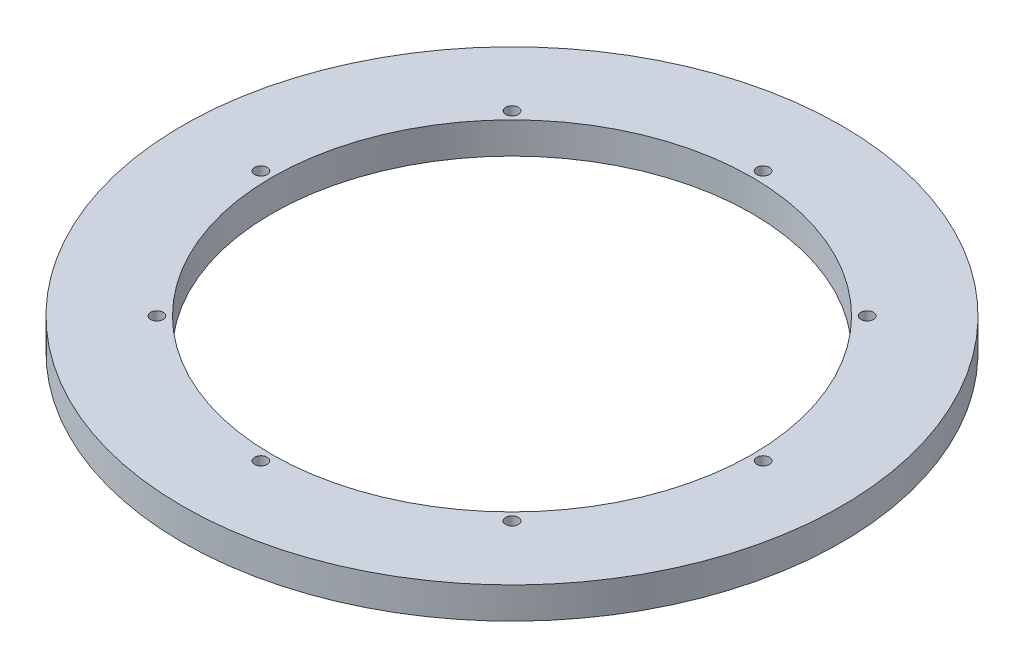
ISO-10303-21;
HEADER;
FILE_DESCRIPTION(('STEP AP214'),'2;1');
FILE_NAME('part.step','',(''),(''),'','','');
FILE_SCHEMA(('AUTOMOTIVE_DESIGN { 1 0 10303 214 1 1 1 1 }'));
ENDSEC;
DATA;
#1=APPLICATION_CONTEXT('core data for automotive mechanical design processes');
#2=APPLICATION_PROTOCOL_DEFINITION('international standard','automotive_design',2000,#1);
#3=PRODUCT_CONTEXT('',#1,'mechanical');
#4=PRODUCT('Part','Part','',(#3));
#5=PRODUCT_RELATED_PRODUCT_CATEGORY('part','',(#4));
#6=PRODUCT_DEFINITION_FORMATION('','',#4);
#7=PRODUCT_DEFINITION_CONTEXT('part definition',#1,'design');
#8=PRODUCT_DEFINITION('design','',#6,#7);
#9=PRODUCT_DEFINITION_SHAPE('','',#8);
#10=(LENGTH_UNIT() NAMED_UNIT(*) SI_UNIT(.MILLI.,.METRE.));
#11=(NAMED_UNIT(*) PLANE_ANGLE_UNIT() SI_UNIT($,.RADIAN.));
#12=(NAMED_UNIT(*) SI_UNIT($,.STERADIAN.) SOLID_ANGLE_UNIT());
#13=UNCERTAINTY_MEASURE_WITH_UNIT(LENGTH_MEASURE(1.E-05),#10,'distance_accuracy_value','');
#14=(GEOMETRIC_REPRESENTATION_CONTEXT(3) GLOBAL_UNCERTAINTY_ASSIGNED_CONTEXT((#13)) GLOBAL_UNIT_ASSIGNED_CONTEXT((#10,
#11,#12)) REPRESENTATION_CONTEXT('',''));
#15=CARTESIAN_POINT('',(0.,0.,0.));
#16=DIRECTION('',(0.,0.,1.));
#17=DIRECTION('',(1.,0.,0.));
#18=AXIS2_PLACEMENT_3D('',#15,#16,#17);
#19=CARTESIAN_POINT('',(0.,-3585.42194874803,-1.2298890050276E-11));
#20=DIRECTION('',(0.,-1.,0.));
#21=DIRECTION('',(0.,0.,-1.));
#22=AXIS2_PLACEMENT_3D('',#19,#20,#21);
#23=CYLINDRICAL_SURFACE('',#22,229.5);
#24=CARTESIAN_POINT('',(0.,15.000000000001,0.));
#25=DIRECTION('',(0.,-1.,0.));
#26=DIRECTION('',(0.,0.,-1.));
#27=AXIS2_PLACEMENT_3D('',#24,#25,#26);
#28=CIRCLE('',#27,229.5);
#29=CARTESIAN_POINT('',(0.,15.0000000000018,-229.5));
#30=VERTEX_POINT('',#29);
#31=EDGE_CURVE('E10',#30,#30,#28,.T.);
#32=ORIENTED_EDGE('',*,*,#31,.F.);
#33=EDGE_LOOP('',(#32));
#34=FACE_BOUND('',#33,.T.);
#35=CARTESIAN_POINT('',(0.,-14.9999999999992,0.));
#36=DIRECTION('',(0.,-1.,0.));
#37=DIRECTION('',(0.,0.,-1.));
#38=AXIS2_PLACEMENT_3D('',#35,#36,#37);
#39=CIRCLE('',#38,229.5);
#40=CARTESIAN_POINT('',(0.,-14.9999999999984,-229.500000000001));
#41=VERTEX_POINT('',#40);
#42=EDGE_CURVE('E54',#41,#41,#39,.T.);
#43=ORIENTED_EDGE('',*,*,#42,.T.);
#44=EDGE_LOOP('',(#43));
#45=FACE_BOUND('',#44,.T.);
#46=ADVANCED_FACE('F37',(#34,#45),#23,.F.);
#47=CARTESIAN_POINT('',(0.,14.9999999999999,315.));
#48=DIRECTION('',(0.,-1.,0.));
#49=DIRECTION('',(0.,0.,-1.));
#50=AXIS2_PLACEMENT_3D('',#47,#48,#49);
#51=PLANE('',#50);
#52=CARTESIAN_POINT('',(0.,15.0000000000018,-240.));
#53=DIRECTION('',(0.,1.,0.));
#54=DIRECTION('',(0.,0.,1.));
#55=AXIS2_PLACEMENT_3D('',#52,#53,#54);
#56=CIRCLE('',#55,6.);
#57=CARTESIAN_POINT('',(0.,15.0000000000018,-234.));
#58=VERTEX_POINT('',#57);
#59=EDGE_CURVE('E117',#58,#58,#56,.T.);
#60=ORIENTED_EDGE('',*,*,#59,.F.);
#61=EDGE_LOOP('',(#60));
#62=FACE_BOUND('',#61,.T.);
#63=CARTESIAN_POINT('',(169.705627484772,15.0000000000015,-169.705627484771));
#64=DIRECTION('',(0.,1.,0.));
#65=DIRECTION('',(0.,0.,1.));
#66=AXIS2_PLACEMENT_3D('',#63,#64,#65);
#67=CIRCLE('',#66,5.99999999999998);
#68=CARTESIAN_POINT('',(169.705627484772,15.0000000000015,-163.705627484771));
#69=VERTEX_POINT('',#68);
#70=EDGE_CURVE('E109',#69,#69,#67,.T.);
#71=ORIENTED_EDGE('',*,*,#70,.F.);
#72=EDGE_LOOP('',(#71));
#73=FACE_BOUND('',#72,.T.);
#74=CARTESIAN_POINT('',(240.,15.000000000001,8.89409256305642E-13));
#75=DIRECTION('',(0.,1.,0.));
#76=DIRECTION('',(0.,0.,1.));
#77=AXIS2_PLACEMENT_3D('',#74,#75,#76);
#78=CIRCLE('',#77,6.);
#79=CARTESIAN_POINT('',(240.,15.0000000000009,6.00000000000089));
#80=VERTEX_POINT('',#79);
#81=EDGE_CURVE('E101',#80,#80,#78,.T.);
#82=ORIENTED_EDGE('',*,*,#81,.F.);
#83=EDGE_LOOP('',(#82));
#84=FACE_BOUND('',#83,.T.);
#85=CARTESIAN_POINT('',(169.70562748477,15.0000000000004,169.705627484772));
#86=DIRECTION('',(0.,1.,0.));
#87=DIRECTION('',(0.,0.,1.));
#88=AXIS2_PLACEMENT_3D('',#85,#86,#87);
#89=CIRCLE('',#88,5.99999999999998);
#90=CARTESIAN_POINT('',(169.70562748477,15.0000000000003,175.705627484772));
#91=VERTEX_POINT('',#90);
#92=EDGE_CURVE('E93',#91,#91,#89,.T.);
#93=ORIENTED_EDGE('',*,*,#92,.F.);
#94=EDGE_LOOP('',(#93));
#95=FACE_BOUND('',#94,.T.);
#96=CARTESIAN_POINT('',(-1.6759110426447E-12,15.0000000000001,240.));
#97=DIRECTION('',(0.,1.,0.));
#98=DIRECTION('',(0.,0.,1.));
#99=AXIS2_PLACEMENT_3D('',#96,#97,#98);
#100=CIRCLE('',#99,6.00000000000001);
#101=CARTESIAN_POINT('',(-1.6759110426447E-12,15.0000000000001,246.));
#102=VERTEX_POINT('',#101);
#103=EDGE_CURVE('E85',#102,#102,#100,.T.);
#104=ORIENTED_EDGE('',*,*,#103,.F.);
#105=EDGE_LOOP('',(#104));
#106=FACE_BOUND('',#105,.T.);
#107=CARTESIAN_POINT('',(-169.705627484773,15.0000000000004,169.70562748477));
#108=DIRECTION('',(0.,1.,0.));
#109=DIRECTION('',(0.,0.,1.));
#110=AXIS2_PLACEMENT_3D('',#107,#108,#109);
#111=CIRCLE('',#110,6.00000000000001);
#112=CARTESIAN_POINT('',(-169.705627484773,15.0000000000003,175.70562748477));
#113=VERTEX_POINT('',#112);
#114=EDGE_CURVE('E77',#113,#113,#111,.T.);
#115=ORIENTED_EDGE('',*,*,#114,.F.);
#116=EDGE_LOOP('',(#115));
#117=FACE_BOUND('',#116,.T.);
#118=CARTESIAN_POINT('',(-240.,15.000000000001,-2.46241282898377E-12));
#119=DIRECTION('',(0.,1.,0.));
#120=DIRECTION('',(0.,0.,1.));
#121=AXIS2_PLACEMENT_3D('',#118,#119,#120);
#122=CIRCLE('',#121,6.);
#123=CARTESIAN_POINT('',(-240.,15.0000000000009,5.99999999999754));
#124=VERTEX_POINT('',#123);
#125=EDGE_CURVE('E69',#124,#124,#122,.T.);
#126=ORIENTED_EDGE('',*,*,#125,.F.);
#127=EDGE_LOOP('',(#126));
#128=FACE_BOUND('',#127,.T.);
#129=CARTESIAN_POINT('',(-169.705627484769,15.0000000000015,-169.705627484773));
#130=DIRECTION('',(0.,1.,0.));
#131=DIRECTION('',(0.,0.,1.));
#132=AXIS2_PLACEMENT_3D('',#129,#130,#131);
#133=CIRCLE('',#132,6.00000000000001);
#134=CARTESIAN_POINT('',(-169.705627484769,15.0000000000015,-163.705627484773));
#135=VERTEX_POINT('',#134);
#136=EDGE_CURVE('E61',#135,#135,#133,.T.);
#137=ORIENTED_EDGE('',*,*,#136,.F.);
#138=EDGE_LOOP('',(#137));
#139=FACE_BOUND('',#138,.T.);
#140=CARTESIAN_POINT('',(0.,15.000000000001,0.));
#141=DIRECTION('',(0.,-1.,0.));
#142=DIRECTION('',(0.,0.,-1.));
#143=AXIS2_PLACEMENT_3D('',#140,#141,#142);
#144=CIRCLE('',#143,315.);
#145=CARTESIAN_POINT('',(0.,15.0000000000021,-315.));
#146=VERTEX_POINT('',#145);
#147=EDGE_CURVE('E44',#146,#146,#144,.T.);
#148=ORIENTED_EDGE('',*,*,#147,.F.);
#149=EDGE_LOOP('',(#148));
#150=FACE_BOUND('',#149,.T.);
#151=ORIENTED_EDGE('',*,*,#31,.T.);
#152=EDGE_LOOP('',(#151));
#153=FACE_BOUND('',#152,.T.);
#154=ADVANCED_FACE('F135',(#62,#73,#84,#95,#106,#117,#128,#139,#150,#153),#51,.F.);
#155=CARTESIAN_POINT('',(0.,-3585.42194874803,-1.2298890050276E-11));
#156=DIRECTION('',(0.,-1.,0.));
#157=DIRECTION('',(0.,0.,-1.));
#158=AXIS2_PLACEMENT_3D('',#155,#156,#157);
#159=CYLINDRICAL_SURFACE('',#158,315.);
#160=CARTESIAN_POINT('',(0.,-14.9999999999992,0.));
#161=DIRECTION('',(0.,-1.,0.));
#162=DIRECTION('',(0.,0.,-1.));
#163=AXIS2_PLACEMENT_3D('',#160,#161,#162);
#164=CIRCLE('',#163,315.000000000001);
#165=CARTESIAN_POINT('',(0.,-14.9999999999982,-315.000000000001));
#166=VERTEX_POINT('',#165);
#167=EDGE_CURVE('E49',#166,#166,#164,.T.);
#168=ORIENTED_EDGE('',*,*,#167,.F.);
#169=EDGE_LOOP('',(#168));
#170=FACE_BOUND('',#169,.T.);
#171=ORIENTED_EDGE('',*,*,#147,.T.);
#172=EDGE_LOOP('',(#171));
#173=FACE_BOUND('',#172,.T.);
#174=ADVANCED_FACE('F138',(#170,#173),#159,.T.);
#175=CARTESIAN_POINT('',(0.,-15.0000000000001,315.));
#176=DIRECTION('',(0.,1.,0.));
#177=DIRECTION('',(0.,0.,1.));
#178=AXIS2_PLACEMENT_3D('',#175,#176,#177);
#179=PLANE('',#178);
#180=CARTESIAN_POINT('',(0.,-14.9999999999987,-240.));
#181=DIRECTION('',(0.,1.,0.));
#182=DIRECTION('',(0.,0.,1.));
#183=AXIS2_PLACEMENT_3D('',#180,#181,#182);
#184=CIRCLE('',#183,6.);
#185=CARTESIAN_POINT('',(0.,-14.9999999999987,-234.));
#186=VERTEX_POINT('',#185);
#187=EDGE_CURVE('E60',#186,#186,#184,.T.);
#188=ORIENTED_EDGE('',*,*,#187,.T.);
#189=EDGE_LOOP('',(#188));
#190=FACE_BOUND('',#189,.T.);
#191=CARTESIAN_POINT('',(169.705627484772,-14.9999999999989,-169.705627484771));
#192=DIRECTION('',(0.,1.,0.));
#193=DIRECTION('',(0.,0.,1.));
#194=AXIS2_PLACEMENT_3D('',#191,#192,#193);
#195=CIRCLE('',#194,5.99999999999998);
#196=CARTESIAN_POINT('',(169.705627484772,-14.999999999999,-163.705627484771));
#197=VERTEX_POINT('',#196);
#198=EDGE_CURVE('E113',#197,#197,#195,.T.);
#199=ORIENTED_EDGE('',*,*,#198,.T.);
#200=EDGE_LOOP('',(#199));
#201=FACE_BOUND('',#200,.T.);
#202=CARTESIAN_POINT('',(240.,-14.9999999999995,7.86501786339067E-13));
#203=DIRECTION('',(0.,1.,0.));
#204=DIRECTION('',(0.,0.,1.));
#205=AXIS2_PLACEMENT_3D('',#202,#203,#204);
#206=CIRCLE('',#205,6.);
#207=CARTESIAN_POINT('',(240.,-14.9999999999996,6.00000000000079));
#208=VERTEX_POINT('',#207);
#209=EDGE_CURVE('E105',#208,#208,#206,.T.);
#210=ORIENTED_EDGE('',*,*,#209,.T.);
#211=EDGE_LOOP('',(#210));
#212=FACE_BOUND('',#211,.T.);
#213=CARTESIAN_POINT('',(169.70562748477,-15.0000000000001,169.705627484772));
#214=DIRECTION('',(0.,1.,0.));
#215=DIRECTION('',(0.,0.,1.));
#216=AXIS2_PLACEMENT_3D('',#213,#214,#215);
#217=CIRCLE('',#216,5.99999999999998);
#218=CARTESIAN_POINT('',(169.70562748477,-15.0000000000001,175.705627484772));
#219=VERTEX_POINT('',#218);
#220=EDGE_CURVE('E97',#219,#219,#217,.T.);
#221=ORIENTED_EDGE('',*,*,#220,.T.);
#222=EDGE_LOOP('',(#221));
#223=FACE_BOUND('',#222,.T.);
#224=CARTESIAN_POINT('',(-1.6759110426447E-12,-15.0000000000004,240.));
#225=DIRECTION('',(0.,1.,0.));
#226=DIRECTION('',(0.,0.,1.));
#227=AXIS2_PLACEMENT_3D('',#224,#225,#226);
#228=CIRCLE('',#227,6.00000000000001);
#229=CARTESIAN_POINT('',(-1.6759110426447E-12,-15.0000000000004,246.));
#230=VERTEX_POINT('',#229);
#231=EDGE_CURVE('E89',#230,#230,#228,.T.);
#232=ORIENTED_EDGE('',*,*,#231,.T.);
#233=EDGE_LOOP('',(#232));
#234=FACE_BOUND('',#233,.T.);
#235=CARTESIAN_POINT('',(-169.705627484773,-15.0000000000001,169.70562748477));
#236=DIRECTION('',(0.,1.,0.));
#237=DIRECTION('',(0.,0.,1.));
#238=AXIS2_PLACEMENT_3D('',#235,#236,#237);
#239=CIRCLE('',#238,6.00000000000001);
#240=CARTESIAN_POINT('',(-169.705627484773,-15.0000000000001,175.70562748477));
#241=VERTEX_POINT('',#240);
#242=EDGE_CURVE('E81',#241,#241,#239,.T.);
#243=ORIENTED_EDGE('',*,*,#242,.T.);
#244=EDGE_LOOP('',(#243));
#245=FACE_BOUND('',#244,.T.);
#246=CARTESIAN_POINT('',(-240.,-14.9999999999995,-2.56532029895034E-12));
#247=DIRECTION('',(0.,1.,0.));
#248=DIRECTION('',(0.,0.,1.));
#249=AXIS2_PLACEMENT_3D('',#246,#247,#248);
#250=CIRCLE('',#249,6.);
#251=CARTESIAN_POINT('',(-240.,-14.9999999999996,5.99999999999744));
#252=VERTEX_POINT('',#251);
#253=EDGE_CURVE('E73',#252,#252,#250,.T.);
#254=ORIENTED_EDGE('',*,*,#253,.T.);
#255=EDGE_LOOP('',(#254));
#256=FACE_BOUND('',#255,.T.);
#257=CARTESIAN_POINT('',(-169.705627484769,-14.9999999999989,-169.705627484774));
#258=DIRECTION('',(0.,1.,0.));
#259=DIRECTION('',(0.,0.,1.));
#260=AXIS2_PLACEMENT_3D('',#257,#258,#259);
#261=CIRCLE('',#260,6.00000000000001);
#262=CARTESIAN_POINT('',(-169.705627484769,-14.999999999999,-163.705627484774));
#263=VERTEX_POINT('',#262);
#264=EDGE_CURVE('E65',#263,#263,#261,.T.);
#265=ORIENTED_EDGE('',*,*,#264,.T.);
#266=EDGE_LOOP('',(#265));
#267=FACE_BOUND('',#266,.T.);
#268=ORIENTED_EDGE('',*,*,#42,.F.);
#269=EDGE_LOOP('',(#268));
#270=FACE_BOUND('',#269,.T.);
#271=ORIENTED_EDGE('',*,*,#167,.T.);
#272=EDGE_LOOP('',(#271));
#273=FACE_BOUND('',#272,.T.);
#274=ADVANCED_FACE('F125',(#190,#201,#212,#223,#234,#245,#256,#267,#270,#273),#179,.F.);
#275=CARTESIAN_POINT('',(-169.705627484769,-14.9999999999989,-169.705627484774));
#276=DIRECTION('',(0.,1.,0.));
#277=DIRECTION('',(0.,0.,1.));
#278=AXIS2_PLACEMENT_3D('',#275,#276,#277);
#279=CYLINDRICAL_SURFACE('',#278,6.00000000000001);
#280=ORIENTED_EDGE('',*,*,#264,.F.);
#281=EDGE_LOOP('',(#280));
#282=FACE_BOUND('',#281,.T.);
#283=ORIENTED_EDGE('',*,*,#136,.T.);
#284=EDGE_LOOP('',(#283));
#285=FACE_BOUND('',#284,.T.);
#286=ADVANCED_FACE('F154',(#282,#285),#279,.F.);
#287=CARTESIAN_POINT('',(-240.,-14.9999999999995,-2.56532029895034E-12));
#288=DIRECTION('',(0.,1.,0.));
#289=DIRECTION('',(0.,0.,1.));
#290=AXIS2_PLACEMENT_3D('',#287,#288,#289);
#291=CYLINDRICAL_SURFACE('',#290,6.);
#292=ORIENTED_EDGE('',*,*,#253,.F.);
#293=EDGE_LOOP('',(#292));
#294=FACE_BOUND('',#293,.T.);
#295=ORIENTED_EDGE('',*,*,#125,.T.);
#296=EDGE_LOOP('',(#295));
#297=FACE_BOUND('',#296,.T.);
#298=ADVANCED_FACE('F156',(#294,#297),#291,.F.);
#299=CARTESIAN_POINT('',(-169.705627484773,-15.0000000000001,169.70562748477));
#300=DIRECTION('',(0.,1.,0.));
#301=DIRECTION('',(0.,0.,1.));
#302=AXIS2_PLACEMENT_3D('',#299,#300,#301);
#303=CYLINDRICAL_SURFACE('',#302,6.00000000000001);
#304=ORIENTED_EDGE('',*,*,#242,.F.);
#305=EDGE_LOOP('',(#304));
#306=FACE_BOUND('',#305,.T.);
#307=ORIENTED_EDGE('',*,*,#114,.T.);
#308=EDGE_LOOP('',(#307));
#309=FACE_BOUND('',#308,.T.);
#310=ADVANCED_FACE('F163',(#306,#309),#303,.F.);
#311=CARTESIAN_POINT('',(-1.6759110426447E-12,-15.0000000000004,240.));
#312=DIRECTION('',(0.,1.,0.));
#313=DIRECTION('',(0.,0.,1.));
#314=AXIS2_PLACEMENT_3D('',#311,#312,#313);
#315=CYLINDRICAL_SURFACE('',#314,6.00000000000001);
#316=ORIENTED_EDGE('',*,*,#231,.F.);
#317=EDGE_LOOP('',(#316));
#318=FACE_BOUND('',#317,.T.);
#319=ORIENTED_EDGE('',*,*,#103,.T.);
#320=EDGE_LOOP('',(#319));
#321=FACE_BOUND('',#320,.T.);
#322=ADVANCED_FACE('F209',(#318,#321),#315,.F.);
#323=CARTESIAN_POINT('',(169.70562748477,-15.0000000000001,169.705627484772));
#324=DIRECTION('',(0.,1.,0.));
#325=DIRECTION('',(0.,0.,1.));
#326=AXIS2_PLACEMENT_3D('',#323,#324,#325);
#327=CYLINDRICAL_SURFACE('',#326,5.99999999999998);
#328=ORIENTED_EDGE('',*,*,#220,.F.);
#329=EDGE_LOOP('',(#328));
#330=FACE_BOUND('',#329,.T.);
#331=ORIENTED_EDGE('',*,*,#92,.T.);
#332=EDGE_LOOP('',(#331));
#333=FACE_BOUND('',#332,.T.);
#334=ADVANCED_FACE('F219',(#330,#333),#327,.F.);
#335=CARTESIAN_POINT('',(240.,-14.9999999999995,7.86501786339067E-13));
#336=DIRECTION('',(0.,1.,0.));
#337=DIRECTION('',(0.,0.,1.));
#338=AXIS2_PLACEMENT_3D('',#335,#336,#337);
#339=CYLINDRICAL_SURFACE('',#338,6.);
#340=ORIENTED_EDGE('',*,*,#209,.F.);
#341=EDGE_LOOP('',(#340));
#342=FACE_BOUND('',#341,.T.);
#343=ORIENTED_EDGE('',*,*,#81,.T.);
#344=EDGE_LOOP('',(#343));
#345=FACE_BOUND('',#344,.T.);
#346=ADVANCED_FACE('F229',(#342,#345),#339,.F.);
#347=CARTESIAN_POINT('',(169.705627484772,-14.9999999999989,-169.705627484771));
#348=DIRECTION('',(0.,1.,0.));
#349=DIRECTION('',(0.,0.,1.));
#350=AXIS2_PLACEMENT_3D('',#347,#348,#349);
#351=CYLINDRICAL_SURFACE('',#350,5.99999999999998);
#352=ORIENTED_EDGE('',*,*,#198,.F.);
#353=EDGE_LOOP('',(#352));
#354=FACE_BOUND('',#353,.T.);
#355=ORIENTED_EDGE('',*,*,#70,.T.);
#356=EDGE_LOOP('',(#355));
#357=FACE_BOUND('',#356,.T.);
#358=ADVANCED_FACE('F131',(#354,#357),#351,.F.);
#359=CARTESIAN_POINT('',(0.,-14.9999999999987,-240.));
#360=DIRECTION('',(0.,1.,0.));
#361=DIRECTION('',(0.,0.,1.));
#362=AXIS2_PLACEMENT_3D('',#359,#360,#361);
#363=CYLINDRICAL_SURFACE('',#362,6.);
#364=ORIENTED_EDGE('',*,*,#187,.F.);
#365=EDGE_LOOP('',(#364));
#366=FACE_BOUND('',#365,.T.);
#367=ORIENTED_EDGE('',*,*,#59,.T.);
#368=EDGE_LOOP('',(#367));
#369=FACE_BOUND('',#368,.T.);
#370=ADVANCED_FACE('F128',(#366,#369),#363,.F.);
#371=CLOSED_SHELL('',(#46,#154,#174,#274,#286,#298,#310,#322,#334,#346,#358,#370));
#372=MANIFOLD_SOLID_BREP('B2',#371);
#373=ADVANCED_BREP_SHAPE_REPRESENTATION('',(#18,#372),#14);
#374=SHAPE_DEFINITION_REPRESENTATION(#9,#373);
ENDSEC;
END-ISO-10303-21;
